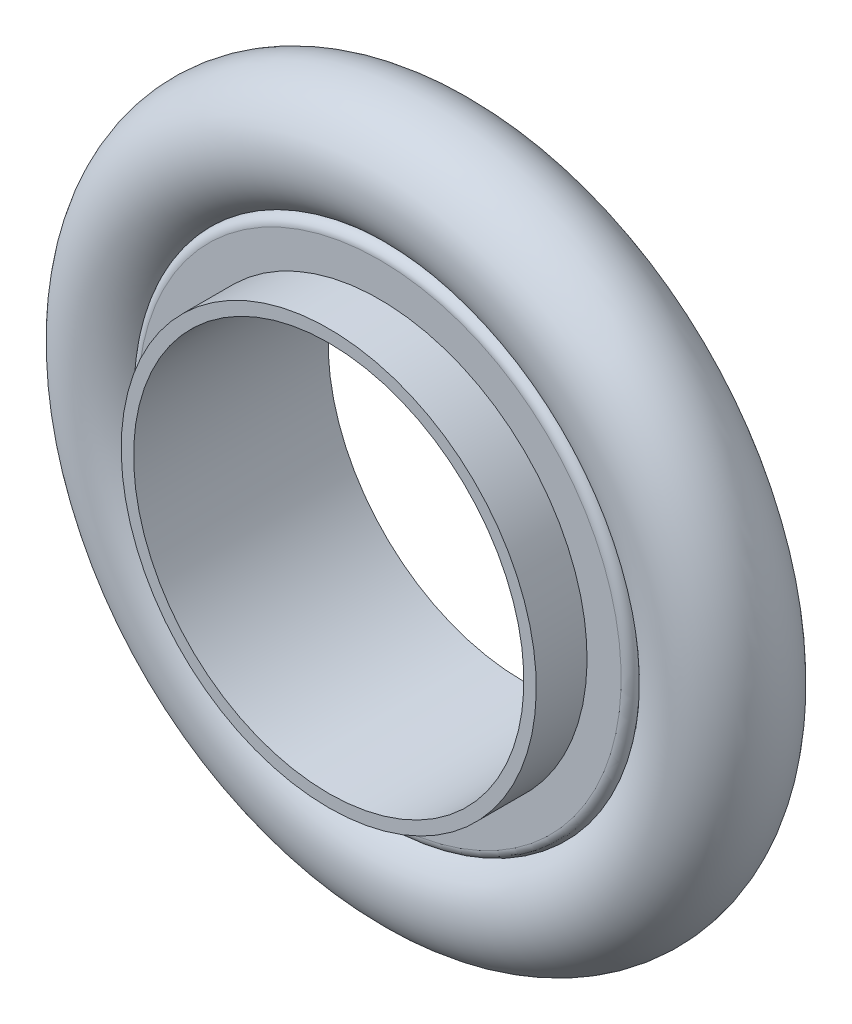
ISO-10303-21;
HEADER;
FILE_DESCRIPTION(('STEP AP214'),'2;1');
FILE_NAME('part.step','',(''),(''),'','','');
FILE_SCHEMA(('AUTOMOTIVE_DESIGN { 1 0 10303 214 1 1 1 1 }'));
ENDSEC;
DATA;
#1=APPLICATION_CONTEXT('core data for automotive mechanical design processes');
#2=APPLICATION_PROTOCOL_DEFINITION('international standard','automotive_design',2000,#1);
#3=PRODUCT_CONTEXT('',#1,'mechanical');
#4=PRODUCT('Part','Part','',(#3));
#5=PRODUCT_RELATED_PRODUCT_CATEGORY('part','',(#4));
#6=PRODUCT_DEFINITION_FORMATION('','',#4);
#7=PRODUCT_DEFINITION_CONTEXT('part definition',#1,'design');
#8=PRODUCT_DEFINITION('design','',#6,#7);
#9=PRODUCT_DEFINITION_SHAPE('','',#8);
#10=(LENGTH_UNIT() NAMED_UNIT(*) SI_UNIT(.MILLI.,.METRE.));
#11=(NAMED_UNIT(*) PLANE_ANGLE_UNIT() SI_UNIT($,.RADIAN.));
#12=(NAMED_UNIT(*) SI_UNIT($,.STERADIAN.) SOLID_ANGLE_UNIT());
#13=UNCERTAINTY_MEASURE_WITH_UNIT(LENGTH_MEASURE(1.E-05),#10,'distance_accuracy_value','');
#14=(GEOMETRIC_REPRESENTATION_CONTEXT(3) GLOBAL_UNCERTAINTY_ASSIGNED_CONTEXT((#13)) GLOBAL_UNIT_ASSIGNED_CONTEXT((#10,
#11,#12)) REPRESENTATION_CONTEXT('',''));
#15=CARTESIAN_POINT('',(0.,0.,0.));
#16=DIRECTION('',(0.,0.,1.));
#17=DIRECTION('',(1.,0.,0.));
#18=AXIS2_PLACEMENT_3D('',#15,#16,#17);
#19=CARTESIAN_POINT('',(0.,0.,0.));
#20=DIRECTION('',(0.,0.,1.));
#21=DIRECTION('',(0.,-1.,0.));
#22=AXIS2_PLACEMENT_3D('',#19,#20,#21);
#23=TOROIDAL_SURFACE('',#22,12.1613372824156,2.41572271758437);
#24=CARTESIAN_POINT('',(0.,-14.57706,0.));
#25=VERTEX_POINT('',#24);
#26=VERTEX_LOOP('',#25);
#27=FACE_BOUND('',#26,.T.);
#28=ADVANCED_FACE('F51',(#27),#23,.T.);
#29=CLOSED_SHELL('',(#28));
#30=MANIFOLD_SOLID_BREP('B2',#29);
#31=CARTESIAN_POINT('',(0.,0.,0.));
#32=DIRECTION('',(0.,0.,1.));
#33=DIRECTION('',(0.,-1.,0.));
#34=AXIS2_PLACEMENT_3D('',#31,#32,#33);
#35=TOROIDAL_SURFACE('',#34,12.1613372824156,2.41572271758437);
#36=CARTESIAN_POINT('',(0.,0.,1.524));
#37=DIRECTION('',(0.,0.,1.));
#38=DIRECTION('',(0.,-1.,0.));
#39=AXIS2_PLACEMENT_3D('',#36,#37,#38);
#40=CIRCLE('',#39,10.287);
#41=CARTESIAN_POINT('',(0.,-10.287,1.524));
#42=VERTEX_POINT('',#41);
#43=EDGE_CURVE('E50',#42,#42,#40,.T.);
#44=ORIENTED_EDGE('',*,*,#43,.F.);
#45=EDGE_LOOP('',(#44));
#46=FACE_BOUND('',#45,.T.);
#47=CARTESIAN_POINT('',(0.,0.,-1.524));
#48=DIRECTION('',(0.,0.,1.));
#49=DIRECTION('',(0.,-1.,0.));
#50=AXIS2_PLACEMENT_3D('',#47,#48,#49);
#51=CIRCLE('',#50,10.287);
#52=CARTESIAN_POINT('',(0.,-10.287,-1.524));
#53=VERTEX_POINT('',#52);
#54=EDGE_CURVE('E110',#53,#53,#51,.T.);
#55=ORIENTED_EDGE('',*,*,#54,.T.);
#56=EDGE_LOOP('',(#55));
#57=FACE_BOUND('',#56,.T.);
#58=ADVANCED_FACE('F65',(#46,#57),#35,.F.);
#59=CARTESIAN_POINT('',(0.,0.,1.524));
#60=DIRECTION('',(0.,0.,1.));
#61=DIRECTION('',(0.,-1.,0.));
#62=AXIS2_PLACEMENT_3D('',#59,#60,#61);
#63=TOROIDAL_SURFACE('',#62,9.90600000000001,0.380999999999998);
#64=CARTESIAN_POINT('',(0.,0.,1.905));
#65=DIRECTION('',(0.,0.,1.));
#66=DIRECTION('',(0.,-1.,0.));
#67=AXIS2_PLACEMENT_3D('',#64,#65,#66);
#68=CIRCLE('',#67,9.90600000000001);
#69=CARTESIAN_POINT('',(0.,-9.90600000000001,1.905));
#70=VERTEX_POINT('',#69);
#71=EDGE_CURVE('E72',#70,#70,#68,.T.);
#72=ORIENTED_EDGE('',*,*,#71,.F.);
#73=EDGE_LOOP('',(#72));
#74=FACE_BOUND('',#73,.T.);
#75=ORIENTED_EDGE('',*,*,#43,.T.);
#76=EDGE_LOOP('',(#75));
#77=FACE_BOUND('',#76,.T.);
#78=ADVANCED_FACE('F161',(#74,#77),#63,.T.);
#79=CARTESIAN_POINT('',(0.,8.509,1.905));
#80=DIRECTION('',(0.,0.,-1.));
#81=DIRECTION('',(0.,1.,0.));
#82=AXIS2_PLACEMENT_3D('',#79,#80,#81);
#83=PLANE('',#82);
#84=CARTESIAN_POINT('',(0.,0.,1.905));
#85=DIRECTION('',(0.,0.,1.));
#86=DIRECTION('',(0.,-1.,0.));
#87=AXIS2_PLACEMENT_3D('',#84,#85,#86);
#88=CIRCLE('',#87,8.509);
#89=CARTESIAN_POINT('',(0.,-8.509,1.905));
#90=VERTEX_POINT('',#89);
#91=EDGE_CURVE('E79',#90,#90,#88,.T.);
#92=ORIENTED_EDGE('',*,*,#91,.F.);
#93=EDGE_LOOP('',(#92));
#94=FACE_BOUND('',#93,.T.);
#95=ORIENTED_EDGE('',*,*,#71,.T.);
#96=EDGE_LOOP('',(#95));
#97=FACE_BOUND('',#96,.T.);
#98=ADVANCED_FACE('F156',(#94,#97),#83,.F.);
#99=CARTESIAN_POINT('',(0.,0.,3.9878));
#100=DIRECTION('',(0.,0.,1.));
#101=DIRECTION('',(0.,-1.,0.));
#102=AXIS2_PLACEMENT_3D('',#99,#100,#101);
#103=CYLINDRICAL_SURFACE('',#102,8.509);
#104=CARTESIAN_POINT('',(0.,0.,3.9878));
#105=DIRECTION('',(0.,0.,1.));
#106=DIRECTION('',(0.,-1.,0.));
#107=AXIS2_PLACEMENT_3D('',#104,#105,#106);
#108=CIRCLE('',#107,8.509);
#109=CARTESIAN_POINT('',(0.,-8.509,3.9878));
#110=VERTEX_POINT('',#109);
#111=EDGE_CURVE('E85',#110,#110,#108,.T.);
#112=ORIENTED_EDGE('',*,*,#111,.F.);
#113=EDGE_LOOP('',(#112));
#114=FACE_BOUND('',#113,.T.);
#115=ORIENTED_EDGE('',*,*,#91,.T.);
#116=EDGE_LOOP('',(#115));
#117=FACE_BOUND('',#116,.T.);
#118=ADVANCED_FACE('F150',(#114,#117),#103,.T.);
#119=CARTESIAN_POINT('',(0.,8.001,3.9878));
#120=DIRECTION('',(0.,0.,-1.));
#121=DIRECTION('',(0.,1.,0.));
#122=AXIS2_PLACEMENT_3D('',#119,#120,#121);
#123=PLANE('',#122);
#124=CARTESIAN_POINT('',(0.,0.,3.9878));
#125=DIRECTION('',(0.,0.,1.));
#126=DIRECTION('',(0.,-1.,0.));
#127=AXIS2_PLACEMENT_3D('',#124,#125,#126);
#128=CIRCLE('',#127,8.001);
#129=CARTESIAN_POINT('',(0.,-8.001,3.9878));
#130=VERTEX_POINT('',#129);
#131=EDGE_CURVE('E91',#130,#130,#128,.T.);
#132=ORIENTED_EDGE('',*,*,#131,.F.);
#133=EDGE_LOOP('',(#132));
#134=FACE_BOUND('',#133,.T.);
#135=ORIENTED_EDGE('',*,*,#111,.T.);
#136=EDGE_LOOP('',(#135));
#137=FACE_BOUND('',#136,.T.);
#138=ADVANCED_FACE('F144',(#134,#137),#123,.F.);
#139=CARTESIAN_POINT('',(0.,0.,3.9878));
#140=DIRECTION('',(0.,0.,1.));
#141=DIRECTION('',(0.,-1.,0.));
#142=AXIS2_PLACEMENT_3D('',#139,#140,#141);
#143=CYLINDRICAL_SURFACE('',#142,8.001);
#144=CARTESIAN_POINT('',(0.,0.,-3.9878));
#145=DIRECTION('',(0.,0.,1.));
#146=DIRECTION('',(0.,-1.,0.));
#147=AXIS2_PLACEMENT_3D('',#144,#145,#146);
#148=CIRCLE('',#147,8.001);
#149=CARTESIAN_POINT('',(0.,-8.001,-3.9878));
#150=VERTEX_POINT('',#149);
#151=EDGE_CURVE('E95',#150,#150,#148,.T.);
#152=ORIENTED_EDGE('',*,*,#151,.F.);
#153=EDGE_LOOP('',(#152));
#154=FACE_BOUND('',#153,.T.);
#155=ORIENTED_EDGE('',*,*,#131,.T.);
#156=EDGE_LOOP('',(#155));
#157=FACE_BOUND('',#156,.T.);
#158=ADVANCED_FACE('F138',(#154,#157),#143,.F.);
#159=CARTESIAN_POINT('',(0.,8.001,-3.9878));
#160=DIRECTION('',(0.,0.,1.));
#161=DIRECTION('',(0.,-1.,0.));
#162=AXIS2_PLACEMENT_3D('',#159,#160,#161);
#163=PLANE('',#162);
#164=CARTESIAN_POINT('',(0.,0.,-3.9878));
#165=DIRECTION('',(0.,0.,1.));
#166=DIRECTION('',(0.,-1.,0.));
#167=AXIS2_PLACEMENT_3D('',#164,#165,#166);
#168=CIRCLE('',#167,8.509);
#169=CARTESIAN_POINT('',(0.,-8.509,-3.9878));
#170=VERTEX_POINT('',#169);
#171=EDGE_CURVE('E98',#170,#170,#168,.T.);
#172=ORIENTED_EDGE('',*,*,#171,.F.);
#173=EDGE_LOOP('',(#172));
#174=FACE_BOUND('',#173,.T.);
#175=ORIENTED_EDGE('',*,*,#151,.T.);
#176=EDGE_LOOP('',(#175));
#177=FACE_BOUND('',#176,.T.);
#178=ADVANCED_FACE('F132',(#174,#177),#163,.F.);
#179=CARTESIAN_POINT('',(0.,0.,3.9878));
#180=DIRECTION('',(0.,0.,1.));
#181=DIRECTION('',(0.,-1.,0.));
#182=AXIS2_PLACEMENT_3D('',#179,#180,#181);
#183=CYLINDRICAL_SURFACE('',#182,8.509);
#184=CARTESIAN_POINT('',(0.,0.,-1.905));
#185=DIRECTION('',(0.,0.,1.));
#186=DIRECTION('',(0.,-1.,0.));
#187=AXIS2_PLACEMENT_3D('',#184,#185,#186);
#188=CIRCLE('',#187,8.509);
#189=CARTESIAN_POINT('',(0.,-8.509,-1.905));
#190=VERTEX_POINT('',#189);
#191=EDGE_CURVE('E102',#190,#190,#188,.T.);
#192=ORIENTED_EDGE('',*,*,#191,.F.);
#193=EDGE_LOOP('',(#192));
#194=FACE_BOUND('',#193,.T.);
#195=ORIENTED_EDGE('',*,*,#171,.T.);
#196=EDGE_LOOP('',(#195));
#197=FACE_BOUND('',#196,.T.);
#198=ADVANCED_FACE('F126',(#194,#197),#183,.T.);
#199=CARTESIAN_POINT('',(0.,8.509,-1.905));
#200=DIRECTION('',(0.,0.,1.));
#201=DIRECTION('',(0.,-1.,0.));
#202=AXIS2_PLACEMENT_3D('',#199,#200,#201);
#203=PLANE('',#202);
#204=CARTESIAN_POINT('',(0.,0.,-1.905));
#205=DIRECTION('',(0.,0.,1.));
#206=DIRECTION('',(0.,-1.,0.));
#207=AXIS2_PLACEMENT_3D('',#204,#205,#206);
#208=CIRCLE('',#207,9.90600000000001);
#209=CARTESIAN_POINT('',(0.,-9.90600000000001,-1.905));
#210=VERTEX_POINT('',#209);
#211=EDGE_CURVE('E106',#210,#210,#208,.T.);
#212=ORIENTED_EDGE('',*,*,#211,.F.);
#213=EDGE_LOOP('',(#212));
#214=FACE_BOUND('',#213,.T.);
#215=ORIENTED_EDGE('',*,*,#191,.T.);
#216=EDGE_LOOP('',(#215));
#217=FACE_BOUND('',#216,.T.);
#218=ADVANCED_FACE('F120',(#214,#217),#203,.F.);
#219=CARTESIAN_POINT('',(0.,0.,-1.524));
#220=DIRECTION('',(0.,0.,1.));
#221=DIRECTION('',(0.,-1.,0.));
#222=AXIS2_PLACEMENT_3D('',#219,#220,#221);
#223=TOROIDAL_SURFACE('',#222,9.90600000000001,0.380999999999998);
#224=ORIENTED_EDGE('',*,*,#54,.F.);
#225=EDGE_LOOP('',(#224));
#226=FACE_BOUND('',#225,.T.);
#227=ORIENTED_EDGE('',*,*,#211,.T.);
#228=EDGE_LOOP('',(#227));
#229=FACE_BOUND('',#228,.T.);
#230=ADVANCED_FACE('F117',(#226,#229),#223,.T.);
#231=CLOSED_SHELL('',(#58,#78,#98,#118,#138,#158,#178,#198,#218,#230));
#232=MANIFOLD_SOLID_BREP('B6',#231);
#233=ADVANCED_BREP_SHAPE_REPRESENTATION('',(#18,#30,#232),#14);
#234=SHAPE_DEFINITION_REPRESENTATION(#9,#233);
ENDSEC;
END-ISO-10303-21;
